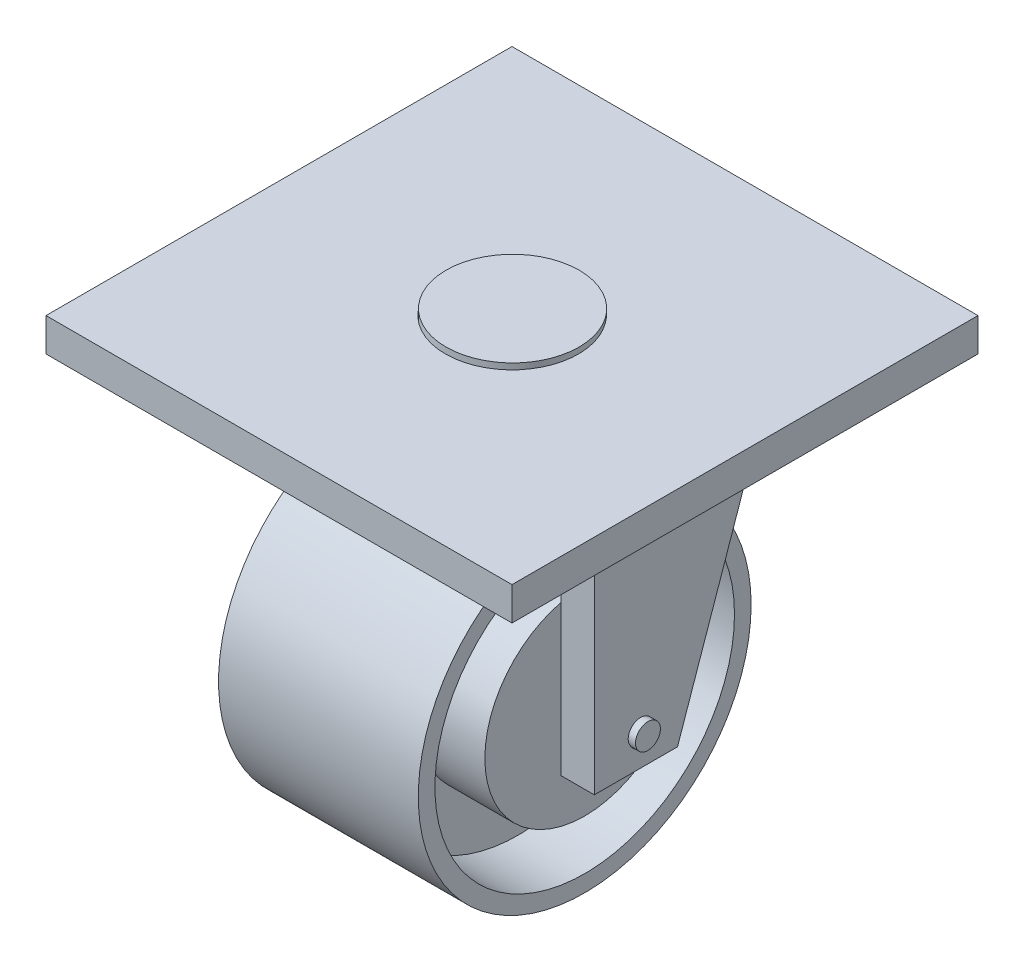
ISO-10303-21;
HEADER;
FILE_DESCRIPTION(('STEP AP214'),'2;1');
FILE_NAME('part.step','',(''),(''),'','','');
FILE_SCHEMA(('AUTOMOTIVE_DESIGN { 1 0 10303 214 1 1 1 1 }'));
ENDSEC;
DATA;
#1=APPLICATION_CONTEXT('core data for automotive mechanical design processes');
#2=APPLICATION_PROTOCOL_DEFINITION('international standard','automotive_design',2000,#1);
#3=PRODUCT_CONTEXT('',#1,'mechanical');
#4=PRODUCT('Part','Part','',(#3));
#5=PRODUCT_RELATED_PRODUCT_CATEGORY('part','',(#4));
#6=PRODUCT_DEFINITION_FORMATION('','',#4);
#7=PRODUCT_DEFINITION_CONTEXT('part definition',#1,'design');
#8=PRODUCT_DEFINITION('design','',#6,#7);
#9=PRODUCT_DEFINITION_SHAPE('','',#8);
#10=(LENGTH_UNIT() NAMED_UNIT(*) SI_UNIT(.MILLI.,.METRE.));
#11=(NAMED_UNIT(*) PLANE_ANGLE_UNIT() SI_UNIT($,.RADIAN.));
#12=(NAMED_UNIT(*) SI_UNIT($,.STERADIAN.) SOLID_ANGLE_UNIT());
#13=UNCERTAINTY_MEASURE_WITH_UNIT(LENGTH_MEASURE(1.E-05),#10,'distance_accuracy_value','');
#14=(GEOMETRIC_REPRESENTATION_CONTEXT(3) GLOBAL_UNCERTAINTY_ASSIGNED_CONTEXT((#13)) GLOBAL_UNIT_ASSIGNED_CONTEXT((#10,
#11,#12)) REPRESENTATION_CONTEXT('',''));
#15=CARTESIAN_POINT('',(0.,0.,0.));
#16=DIRECTION('',(0.,0.,1.));
#17=DIRECTION('',(1.,0.,0.));
#18=AXIS2_PLACEMENT_3D('',#15,#16,#17);
#19=CARTESIAN_POINT('',(-7.63342853739944,6.14559672903132,19.4440529927582));
#20=DIRECTION('',(1.,0.,0.));
#21=DIRECTION('',(0.,0.,-1.));
#22=AXIS2_PLACEMENT_3D('',#19,#20,#21);
#23=PLANE('',#22);
#24=DIRECTION('',(0.,-0.949497336702955,0.313775090779996));
#25=VECTOR('',#24,1.);
#26=CARTESIAN_POINT('',(-7.63342853739944,12.8166493606103,16.9669845814205));
#27=LINE('',#26,#25);
#28=CARTESIAN_POINT('',(-7.63342853739944,11.0807509480564,17.540637251027));
#29=VERTEX_POINT('',#28);
#30=CARTESIAN_POINT('',(-7.63342853739944,10.9260844776881,17.591749017121));
#31=VERTEX_POINT('',#30);
#32=EDGE_CURVE('P0_E25',#29,#31,#27,.T.);
#33=ORIENTED_EDGE('',*,*,#32,.F.);
#34=DIRECTION('',(0.,-1.,0.));
#35=VECTOR('',#34,1.);
#36=CARTESIAN_POINT('',(-7.63342853739944,10.9260844776881,17.540637251027));
#37=LINE('',#36,#35);
#38=CARTESIAN_POINT('',(-7.63342853739944,10.9260844776881,17.540637251027));
#39=VERTEX_POINT('',#38);
#40=EDGE_CURVE('P0_E148',#29,#39,#37,.T.);
#41=ORIENTED_EDGE('',*,*,#40,.T.);
#42=DIRECTION('',(0.,0.,1.));
#43=VECTOR('',#42,1.);
#44=CARTESIAN_POINT('',(-7.63342853739944,10.9260844776881,17.540637251027));
#45=LINE('',#44,#43);
#46=EDGE_CURVE('P0_E154',#39,#31,#45,.T.);
#47=ORIENTED_EDGE('',*,*,#46,.T.);
#48=EDGE_LOOP('',(#33,#41,#47));
#49=FACE_BOUND('',#48,.T.);
#50=ADVANCED_FACE('P0_F17',(#49),#23,.F.);
#51=CARTESIAN_POINT('',(7.36657146260056,6.14559672903132,19.4440529927582));
#52=DIRECTION('',(1.,0.,0.));
#53=DIRECTION('',(0.,0.,-1.));
#54=AXIS2_PLACEMENT_3D('',#51,#52,#53);
#55=PLANE('',#54);
#56=CARTESIAN_POINT('',(7.36657146260056,-0.380758504231076,24.0683800608071));
#57=DIRECTION('',(-1.,0.,0.));
#58=DIRECTION('',(0.,0.,1.));
#59=AXIS2_PLACEMENT_3D('',#56,#57,#58);
#60=CIRCLE('',#59,0.75);
#61=CARTESIAN_POINT('',(7.36657146260056,-0.380758504231076,24.8183800608071));
#62=VERTEX_POINT('',#61);
#63=EDGE_CURVE('P0_E171',#62,#62,#60,.T.);
#64=ORIENTED_EDGE('',*,*,#63,.F.);
#65=EDGE_LOOP('',(#64));
#66=FACE_BOUND('',#65,.T.);
#67=DIRECTION('',(0.,1.,0.));
#68=VECTOR('',#67,1.);
#69=CARTESIAN_POINT('',(7.36657146260056,10.9260844776881,26.3072646418272));
#70=LINE('',#69,#68);
#71=CARTESIAN_POINT('',(7.36657146260056,10.9260844776881,26.3072646418272));
#72=VERTEX_POINT('',#71);
#73=CARTESIAN_POINT('',(7.36657146260056,12.8166493606103,26.3072646418272));
#74=VERTEX_POINT('',#73);
#75=EDGE_CURVE('P0_E39',#72,#74,#70,.T.);
#76=ORIENTED_EDGE('',*,*,#75,.F.);
#77=DIRECTION('',(0.,0.,1.));
#78=VECTOR('',#77,1.);
#79=CARTESIAN_POINT('',(7.36657146260056,10.9260844776881,17.540637251027));
#80=LINE('',#79,#78);
#81=CARTESIAN_POINT('',(7.36657146260056,10.9260844776881,17.540637251027));
#82=VERTEX_POINT('',#81);
#83=EDGE_CURVE('P0_E149',#82,#72,#80,.T.);
#84=ORIENTED_EDGE('',*,*,#83,.F.);
#85=DIRECTION('',(0.,-1.,0.));
#86=VECTOR('',#85,1.);
#87=CARTESIAN_POINT('',(7.36657146260056,10.9260844776881,17.540637251027));
#88=LINE('',#87,#86);
#89=CARTESIAN_POINT('',(7.36657146260056,12.8166493606103,17.540637251027));
#90=VERTEX_POINT('',#89);
#91=EDGE_CURVE('P0_E139',#90,#82,#88,.T.);
#92=ORIENTED_EDGE('',*,*,#91,.F.);
#93=DIRECTION('',(0.,0.,1.));
#94=VECTOR('',#93,1.);
#95=CARTESIAN_POINT('',(7.36657146260056,12.8166493606103,21.9045793085477));
#96=LINE('',#95,#94);
#97=CARTESIAN_POINT('',(7.36657146260056,12.8166493606103,16.7203687822319));
#98=VERTEX_POINT('',#97);
#99=EDGE_CURVE('P0_E182',#98,#90,#96,.T.);
#100=ORIENTED_EDGE('',*,*,#99,.F.);
#101=DIRECTION('',(0.,0.945143673740315,-0.326654918819022));
#102=VECTOR('',#101,1.);
#103=CARTESIAN_POINT('',(7.36657146260056,12.8166493606103,16.7203687822319));
#104=LINE('',#103,#102);
#105=CARTESIAN_POINT('',(7.36657146260056,-2.18335063938973,21.9045793085477));
#106=VERTEX_POINT('',#105);
#107=EDGE_CURVE('P0_E193',#106,#98,#104,.T.);
#108=ORIENTED_EDGE('',*,*,#107,.F.);
#109=DIRECTION('',(0.,0.,-1.));
#110=VECTOR('',#109,1.);
#111=CARTESIAN_POINT('',(7.36657146260056,-2.18335063938973,21.9045793085477));
#112=LINE('',#111,#110);
#113=CARTESIAN_POINT('',(7.36657146260056,-2.18335063938973,26.9045793085477));
#114=VERTEX_POINT('',#113);
#115=EDGE_CURVE('P0_E191',#114,#106,#112,.T.);
#116=ORIENTED_EDGE('',*,*,#115,.F.);
#117=DIRECTION('',(0.,-1.,0.));
#118=VECTOR('',#117,1.);
#119=CARTESIAN_POINT('',(7.36657146260056,12.8166493606103,26.9045793085477));
#120=LINE('',#119,#118);
#121=CARTESIAN_POINT('',(7.36657146260056,12.8166493606103,26.9045793085477));
#122=VERTEX_POINT('',#121);
#123=EDGE_CURVE('P0_E175',#122,#114,#120,.T.);
#124=ORIENTED_EDGE('',*,*,#123,.F.);
#125=EDGE_CURVE('P0_E195',#74,#122,#96,.T.);
#126=ORIENTED_EDGE('',*,*,#125,.F.);
#127=EDGE_LOOP('',(#76,#84,#92,#100,#108,#116,#124,#126));
#128=FACE_BOUND('',#127,.T.);
#129=ADVANCED_FACE('P0_F253',(#66,#128),#55,.F.);
#130=CARTESIAN_POINT('',(9.36657146260056,12.8166493606103,26.9045793085477));
#131=DIRECTION('',(0.,0.,-1.));
#132=DIRECTION('',(-1.,0.,0.));
#133=AXIS2_PLACEMENT_3D('',#130,#131,#132);
#134=PLANE('',#133);
#135=ORIENTED_EDGE('',*,*,#123,.T.);
#136=DIRECTION('',(-1.,0.,0.));
#137=VECTOR('',#136,1.);
#138=CARTESIAN_POINT('',(9.36657146260056,-2.18335063938973,26.9045793085477));
#139=LINE('',#138,#137);
#140=CARTESIAN_POINT('',(9.36657146260056,-2.18335063938973,26.9045793085477));
#141=VERTEX_POINT('',#140);
#142=EDGE_CURVE('P0_E202',#141,#114,#139,.T.);
#143=ORIENTED_EDGE('',*,*,#142,.F.);
#144=DIRECTION('',(0.,-1.,0.));
#145=VECTOR('',#144,1.);
#146=CARTESIAN_POINT('',(9.36657146260056,12.8166493606103,26.9045793085477));
#147=LINE('',#146,#145);
#148=CARTESIAN_POINT('',(9.36657146260056,12.8166493606103,26.9045793085477));
#149=VERTEX_POINT('',#148);
#150=EDGE_CURVE('P0_E181',#149,#141,#147,.T.);
#151=ORIENTED_EDGE('',*,*,#150,.F.);
#152=DIRECTION('',(-1.,0.,0.));
#153=VECTOR('',#152,1.);
#154=CARTESIAN_POINT('',(9.36657146260056,12.8166493606103,26.9045793085477));
#155=LINE('',#154,#153);
#156=EDGE_CURVE('P0_E204',#149,#122,#155,.T.);
#157=ORIENTED_EDGE('',*,*,#156,.T.);
#158=EDGE_LOOP('',(#135,#143,#151,#157));
#159=FACE_BOUND('',#158,.T.);
#160=ADVANCED_FACE('P0_F19',(#159),#134,.F.);
#161=CARTESIAN_POINT('',(9.36657146260056,-2.18335063938973,21.9045793085477));
#162=DIRECTION('',(0.,1.,0.));
#163=DIRECTION('',(0.,0.,1.));
#164=AXIS2_PLACEMENT_3D('',#161,#162,#163);
#165=PLANE('',#164);
#166=ORIENTED_EDGE('',*,*,#115,.T.);
#167=DIRECTION('',(-1.,0.,0.));
#168=VECTOR('',#167,1.);
#169=CARTESIAN_POINT('',(9.36657146260056,-2.18335063938973,21.9045793085477));
#170=LINE('',#169,#168);
#171=CARTESIAN_POINT('',(9.36657146260056,-2.18335063938973,21.9045793085477));
#172=VERTEX_POINT('',#171);
#173=EDGE_CURVE('P0_E199',#172,#106,#170,.T.);
#174=ORIENTED_EDGE('',*,*,#173,.F.);
#175=DIRECTION('',(0.,0.,-1.));
#176=VECTOR('',#175,1.);
#177=CARTESIAN_POINT('',(9.36657146260056,-2.18335063938973,21.9045793085477));
#178=LINE('',#177,#176);
#179=EDGE_CURVE('P0_E184',#141,#172,#178,.T.);
#180=ORIENTED_EDGE('',*,*,#179,.F.);
#181=ORIENTED_EDGE('',*,*,#142,.T.);
#182=EDGE_LOOP('',(#166,#174,#180,#181));
#183=FACE_BOUND('',#182,.T.);
#184=ADVANCED_FACE('P0_F267',(#183),#165,.F.);
#185=CARTESIAN_POINT('',(9.36657146260056,12.8166493606103,16.7203687822319));
#186=DIRECTION('',(0.,0.326654918819022,0.945143673740315));
#187=DIRECTION('',(0.,-0.945143673740315,0.326654918819022));
#188=AXIS2_PLACEMENT_3D('',#185,#186,#187);
#189=PLANE('',#188);
#190=ORIENTED_EDGE('',*,*,#107,.T.);
#191=DIRECTION('',(-1.,0.,0.));
#192=VECTOR('',#191,1.);
#193=CARTESIAN_POINT('',(9.36657146260056,12.8166493606103,16.7203687822319));
#194=LINE('',#193,#192);
#195=CARTESIAN_POINT('',(9.36657146260056,12.8166493606103,16.7203687822319));
#196=VERTEX_POINT('',#195);
#197=EDGE_CURVE('P0_E189',#196,#98,#194,.T.);
#198=ORIENTED_EDGE('',*,*,#197,.F.);
#199=DIRECTION('',(0.,0.945143673740315,-0.326654918819022));
#200=VECTOR('',#199,1.);
#201=CARTESIAN_POINT('',(9.36657146260056,12.8166493606103,16.7203687822319));
#202=LINE('',#201,#200);
#203=EDGE_CURVE('P0_E186',#172,#196,#202,.T.);
#204=ORIENTED_EDGE('',*,*,#203,.F.);
#205=ORIENTED_EDGE('',*,*,#173,.T.);
#206=EDGE_LOOP('',(#190,#198,#204,#205));
#207=FACE_BOUND('',#206,.T.);
#208=ADVANCED_FACE('P0_F262',(#207),#189,.F.);
#209=CARTESIAN_POINT('',(9.36657146260056,12.8166493606103,21.9045793085477));
#210=DIRECTION('',(0.,-1.,0.));
#211=DIRECTION('',(0.,0.,-1.));
#212=AXIS2_PLACEMENT_3D('',#209,#210,#211);
#213=PLANE('',#212);
#214=CARTESIAN_POINT('',(-0.391053106238549,12.8166493606103,22.0572646418272));
#215=DIRECTION('',(0.,-1.,0.));
#216=DIRECTION('',(0.,0.,-1.));
#217=AXIS2_PLACEMENT_3D('',#214,#215,#216);
#218=CIRCLE('',#217,4.);
#219=CARTESIAN_POINT('',(-0.391053106238549,12.8166493606103,18.0572646418272));
#220=VERTEX_POINT('',#219);
#221=EDGE_CURVE('P0_E11',#220,#220,#218,.F.);
#222=ORIENTED_EDGE('',*,*,#221,.F.);
#223=EDGE_LOOP('',(#222));
#224=FACE_BOUND('',#223,.T.);
#225=ORIENTED_EDGE('',*,*,#99,.T.);
#226=DIRECTION('',(1.,0.,0.));
#227=VECTOR('',#226,1.);
#228=CARTESIAN_POINT('',(-7.63342853739944,12.8166493606103,17.540637251027));
#229=LINE('',#228,#227);
#230=CARTESIAN_POINT('',(-7.63342853739944,12.8166493606103,17.540637251027));
#231=VERTEX_POINT('',#230);
#232=EDGE_CURVE('P0_E165',#231,#90,#229,.T.);
#233=ORIENTED_EDGE('',*,*,#232,.F.);
#234=DIRECTION('',(0.,0.,-1.));
#235=VECTOR('',#234,1.);
#236=CARTESIAN_POINT('',(-7.63342853739944,12.8166493606103,21.9239509464271));
#237=LINE('',#236,#235);
#238=CARTESIAN_POINT('',(-7.63342853739944,12.8166493606103,16.9669845814205));
#239=VERTEX_POINT('',#238);
#240=EDGE_CURVE('P0_E136',#231,#239,#237,.T.);
#241=ORIENTED_EDGE('',*,*,#240,.T.);
#242=DIRECTION('',(1.,0.,0.));
#243=VECTOR('',#242,1.);
#244=CARTESIAN_POINT('',(-9.63342853739944,12.8166493606103,16.9669845814205));
#245=LINE('',#244,#243);
#246=CARTESIAN_POINT('',(-9.63342853739944,12.8166493606103,16.9669845814205));
#247=VERTEX_POINT('',#246);
#248=EDGE_CURVE('P0_E116',#247,#239,#245,.T.);
#249=ORIENTED_EDGE('',*,*,#248,.F.);
#250=DIRECTION('',(0.,0.,-1.));
#251=VECTOR('',#250,1.);
#252=CARTESIAN_POINT('',(-9.63342853739944,12.8166493606103,21.9239509464271));
#253=LINE('',#252,#251);
#254=CARTESIAN_POINT('',(-9.63342853739944,12.8166493606103,26.421813011273));
#255=VERTEX_POINT('',#254);
#256=EDGE_CURVE('P0_E122',#255,#247,#253,.T.);
#257=ORIENTED_EDGE('',*,*,#256,.F.);
#258=DIRECTION('',(1.,0.,0.));
#259=VECTOR('',#258,1.);
#260=CARTESIAN_POINT('',(-9.63342853739944,12.8166493606103,26.421813011273));
#261=LINE('',#260,#259);
#262=CARTESIAN_POINT('',(-7.63342853739944,12.8166493606103,26.421813011273));
#263=VERTEX_POINT('',#262);
#264=EDGE_CURVE('P0_E226',#255,#263,#261,.T.);
#265=ORIENTED_EDGE('',*,*,#264,.T.);
#266=CARTESIAN_POINT('',(-7.63342853739944,12.8166493606103,26.3072646418272));
#267=VERTEX_POINT('',#266);
#268=EDGE_CURVE('P0_E131',#263,#267,#237,.T.);
#269=ORIENTED_EDGE('',*,*,#268,.T.);
#270=DIRECTION('',(1.,0.,0.));
#271=VECTOR('',#270,1.);
#272=CARTESIAN_POINT('',(-7.63342853739944,12.8166493606103,26.3072646418272));
#273=LINE('',#272,#271);
#274=EDGE_CURVE('P0_E168',#267,#74,#273,.T.);
#275=ORIENTED_EDGE('',*,*,#274,.T.);
#276=ORIENTED_EDGE('',*,*,#125,.T.);
#277=ORIENTED_EDGE('',*,*,#156,.F.);
#278=DIRECTION('',(0.,0.,1.));
#279=VECTOR('',#278,1.);
#280=CARTESIAN_POINT('',(9.36657146260056,12.8166493606103,21.9045793085477));
#281=LINE('',#280,#279);
#282=EDGE_CURVE('P0_E178',#196,#149,#281,.T.);
#283=ORIENTED_EDGE('',*,*,#282,.F.);
#284=ORIENTED_EDGE('',*,*,#197,.T.);
#285=EDGE_LOOP('',(#225,#233,#241,#249,#257,#265,#269,#275,#276,#277,#283,#284));
#286=FACE_BOUND('',#285,.T.);
#287=ADVANCED_FACE('P0_F134',(#224,#286),#213,.F.);
#288=CARTESIAN_POINT('',(9.36657146260056,6.14559672903132,19.4440529927582));
#289=DIRECTION('',(1.,0.,0.));
#290=DIRECTION('',(0.,0.,-1.));
#291=AXIS2_PLACEMENT_3D('',#288,#289,#290);
#292=PLANE('',#291);
#293=CARTESIAN_POINT('',(9.36657146260056,-0.380758504231076,24.0683800608071));
#294=DIRECTION('',(-1.,0.,0.));
#295=DIRECTION('',(0.,0.,1.));
#296=AXIS2_PLACEMENT_3D('',#293,#294,#295);
#297=CIRCLE('',#296,0.75);
#298=CARTESIAN_POINT('',(9.36657146260056,-0.380758504231076,24.8183800608071));
#299=VERTEX_POINT('',#298);
#300=EDGE_CURVE('P0_E172',#299,#299,#297,.T.);
#301=ORIENTED_EDGE('',*,*,#300,.T.);
#302=EDGE_LOOP('',(#301));
#303=FACE_BOUND('',#302,.T.);
#304=ORIENTED_EDGE('',*,*,#282,.T.);
#305=ORIENTED_EDGE('',*,*,#150,.T.);
#306=ORIENTED_EDGE('',*,*,#179,.T.);
#307=ORIENTED_EDGE('',*,*,#203,.T.);
#308=EDGE_LOOP('',(#304,#305,#306,#307));
#309=FACE_BOUND('',#308,.T.);
#310=ADVANCED_FACE('P0_F270',(#303,#309),#292,.T.);
#311=CARTESIAN_POINT('',(9.36657146260056,-0.380758504231076,24.0683800608071));
#312=DIRECTION('',(-1.,0.,0.));
#313=DIRECTION('',(0.,0.,1.));
#314=AXIS2_PLACEMENT_3D('',#311,#312,#313);
#315=CYLINDRICAL_SURFACE('',#314,0.75);
#316=ORIENTED_EDGE('',*,*,#300,.F.);
#317=EDGE_LOOP('',(#316));
#318=FACE_BOUND('',#317,.T.);
#319=ORIENTED_EDGE('',*,*,#63,.T.);
#320=EDGE_LOOP('',(#319));
#321=FACE_BOUND('',#320,.T.);
#322=ADVANCED_FACE('P0_F272',(#318,#321),#315,.F.);
#323=CARTESIAN_POINT('',(-7.63342853739944,10.9260844776881,26.3072646418272));
#324=DIRECTION('',(0.,0.,-1.));
#325=DIRECTION('',(-1.,0.,0.));
#326=AXIS2_PLACEMENT_3D('',#323,#324,#325);
#327=PLANE('',#326);
#328=ORIENTED_EDGE('',*,*,#75,.T.);
#329=ORIENTED_EDGE('',*,*,#274,.F.);
#330=DIRECTION('',(0.,1.,0.));
#331=VECTOR('',#330,1.);
#332=CARTESIAN_POINT('',(-7.63342853739944,10.9260844776881,26.3072646418272));
#333=LINE('',#332,#331);
#334=CARTESIAN_POINT('',(-7.63342853739944,10.9260844776881,26.3072646418272));
#335=VERTEX_POINT('',#334);
#336=EDGE_CURVE('P0_E145',#335,#267,#333,.T.);
#337=ORIENTED_EDGE('',*,*,#336,.F.);
#338=DIRECTION('',(1.,0.,0.));
#339=VECTOR('',#338,1.);
#340=CARTESIAN_POINT('',(-7.63342853739944,10.9260844776881,26.3072646418272));
#341=LINE('',#340,#339);
#342=EDGE_CURVE('P0_E155',#335,#72,#341,.T.);
#343=ORIENTED_EDGE('',*,*,#342,.T.);
#344=EDGE_LOOP('',(#328,#329,#337,#343));
#345=FACE_BOUND('',#344,.T.);
#346=ADVANCED_FACE('P0_F247',(#345),#327,.F.);
#347=CARTESIAN_POINT('',(-7.63342853739944,10.9260844776881,17.540637251027));
#348=DIRECTION('',(0.,0.,1.));
#349=DIRECTION('',(1.,0.,0.));
#350=AXIS2_PLACEMENT_3D('',#347,#348,#349);
#351=PLANE('',#350);
#352=ORIENTED_EDGE('',*,*,#91,.T.);
#353=DIRECTION('',(1.,0.,0.));
#354=VECTOR('',#353,1.);
#355=CARTESIAN_POINT('',(-7.63342853739944,10.9260844776881,17.540637251027));
#356=LINE('',#355,#354);
#357=EDGE_CURVE('P0_E162',#39,#82,#356,.T.);
#358=ORIENTED_EDGE('',*,*,#357,.F.);
#359=ORIENTED_EDGE('',*,*,#40,.F.);
#360=EDGE_CURVE('P0_E150',#231,#29,#37,.T.);
#361=ORIENTED_EDGE('',*,*,#360,.F.);
#362=ORIENTED_EDGE('',*,*,#232,.T.);
#363=EDGE_LOOP('',(#352,#358,#359,#361,#362));
#364=FACE_BOUND('',#363,.T.);
#365=ADVANCED_FACE('P0_F256',(#364),#351,.F.);
#366=CARTESIAN_POINT('',(-7.63342853739944,10.9260844776881,17.540637251027));
#367=DIRECTION('',(0.,1.,0.));
#368=DIRECTION('',(0.,0.,1.));
#369=AXIS2_PLACEMENT_3D('',#366,#367,#368);
#370=PLANE('',#369);
#371=ORIENTED_EDGE('',*,*,#83,.T.);
#372=ORIENTED_EDGE('',*,*,#342,.F.);
#373=EDGE_CURVE('P0_E153',#31,#335,#45,.T.);
#374=ORIENTED_EDGE('',*,*,#373,.F.);
#375=ORIENTED_EDGE('',*,*,#46,.F.);
#376=ORIENTED_EDGE('',*,*,#357,.T.);
#377=EDGE_LOOP('',(#371,#372,#374,#375,#376));
#378=FACE_BOUND('',#377,.T.);
#379=ADVANCED_FACE('P0_F250',(#378),#370,.F.);
#380=CARTESIAN_POINT('',(-7.63342853739944,6.14559672903132,19.4440529927582));
#381=DIRECTION('',(-1.,0.,0.));
#382=DIRECTION('',(0.,0.,1.));
#383=AXIS2_PLACEMENT_3D('',#380,#381,#382);
#384=PLANE('',#383);
#385=ORIENTED_EDGE('',*,*,#240,.F.);
#386=ORIENTED_EDGE('',*,*,#360,.T.);
#387=EDGE_CURVE('P0_E209',#239,#29,#27,.T.);
#388=ORIENTED_EDGE('',*,*,#387,.F.);
#389=EDGE_LOOP('',(#385,#386,#388));
#390=FACE_BOUND('',#389,.T.);
#391=ADVANCED_FACE('P0_F296',(#390),#384,.F.);
#392=CARTESIAN_POINT('',(-7.63342853739944,-0.380758504231076,24.0683800608071));
#393=DIRECTION('',(-1.,0.,0.));
#394=DIRECTION('',(0.,0.,1.));
#395=AXIS2_PLACEMENT_3D('',#392,#393,#394);
#396=CIRCLE('',#395,0.75);
#397=CARTESIAN_POINT('',(-7.63342853739944,-0.380758504231076,24.8183800608071));
#398=VERTEX_POINT('',#397);
#399=EDGE_CURVE('P0_E214',#398,#398,#396,.T.);
#400=ORIENTED_EDGE('',*,*,#399,.T.);
#401=EDGE_LOOP('',(#400));
#402=FACE_BOUND('',#401,.T.);
#403=ORIENTED_EDGE('',*,*,#373,.T.);
#404=ORIENTED_EDGE('',*,*,#336,.T.);
#405=ORIENTED_EDGE('',*,*,#268,.F.);
#406=DIRECTION('',(0.,1.,0.));
#407=VECTOR('',#406,1.);
#408=CARTESIAN_POINT('',(-7.63342853739944,12.8166493606103,26.421813011273));
#409=LINE('',#408,#407);
#410=CARTESIAN_POINT('',(-7.63342853739944,-2.18335063938973,26.421813011273));
#411=VERTEX_POINT('',#410);
#412=EDGE_CURVE('P0_E233',#411,#263,#409,.T.);
#413=ORIENTED_EDGE('',*,*,#412,.F.);
#414=DIRECTION('',(0.,0.,1.));
#415=VECTOR('',#414,1.);
#416=CARTESIAN_POINT('',(-7.63342853739944,-2.18335063938973,21.9239509464271));
#417=LINE('',#416,#415);
#418=CARTESIAN_POINT('',(-7.63342853739944,-2.18335063938973,21.9239509464271));
#419=VERTEX_POINT('',#418);
#420=EDGE_CURVE('P0_E213',#419,#411,#417,.T.);
#421=ORIENTED_EDGE('',*,*,#420,.F.);
#422=EDGE_CURVE('P0_E210',#31,#419,#27,.T.);
#423=ORIENTED_EDGE('',*,*,#422,.F.);
#424=EDGE_LOOP('',(#403,#404,#405,#413,#421,#423));
#425=FACE_BOUND('',#424,.T.);
#426=ADVANCED_FACE('P0_F243',(#402,#425),#384,.F.);
#427=CARTESIAN_POINT('',(-9.63342853739944,12.8166493606103,16.9669845814205));
#428=DIRECTION('',(0.,0.313775090779996,0.949497336702955));
#429=DIRECTION('',(0.,-0.949497336702955,0.313775090779996));
#430=AXIS2_PLACEMENT_3D('',#427,#428,#429);
#431=PLANE('',#430);
#432=ORIENTED_EDGE('',*,*,#387,.T.);
#433=ORIENTED_EDGE('',*,*,#32,.T.);
#434=ORIENTED_EDGE('',*,*,#422,.T.);
#435=DIRECTION('',(1.,0.,0.));
#436=VECTOR('',#435,1.);
#437=CARTESIAN_POINT('',(-9.63342853739944,-2.18335063938973,21.9239509464271));
#438=LINE('',#437,#436);
#439=CARTESIAN_POINT('',(-9.63342853739944,-2.18335063938973,21.9239509464271));
#440=VERTEX_POINT('',#439);
#441=EDGE_CURVE('P0_E118',#440,#419,#438,.T.);
#442=ORIENTED_EDGE('',*,*,#441,.F.);
#443=DIRECTION('',(0.,-0.949497336702955,0.313775090779996));
#444=VECTOR('',#443,1.);
#445=CARTESIAN_POINT('',(-9.63342853739944,12.8166493606103,16.9669845814205));
#446=LINE('',#445,#444);
#447=EDGE_CURVE('P0_E111',#247,#440,#446,.T.);
#448=ORIENTED_EDGE('',*,*,#447,.F.);
#449=ORIENTED_EDGE('',*,*,#248,.T.);
#450=EDGE_LOOP('',(#432,#433,#434,#442,#448,#449));
#451=FACE_BOUND('',#450,.T.);
#452=ADVANCED_FACE('P0_F114',(#451),#431,.F.);
#453=CARTESIAN_POINT('',(-9.63342853739944,-2.18335063938973,21.9239509464271));
#454=DIRECTION('',(0.,1.,0.));
#455=DIRECTION('',(0.,0.,1.));
#456=AXIS2_PLACEMENT_3D('',#453,#454,#455);
#457=PLANE('',#456);
#458=ORIENTED_EDGE('',*,*,#420,.T.);
#459=DIRECTION('',(1.,0.,0.));
#460=VECTOR('',#459,1.);
#461=CARTESIAN_POINT('',(-9.63342853739944,-2.18335063938973,26.421813011273));
#462=LINE('',#461,#460);
#463=CARTESIAN_POINT('',(-9.63342853739944,-2.18335063938973,26.421813011273));
#464=VERTEX_POINT('',#463);
#465=EDGE_CURVE('P0_E141',#464,#411,#462,.T.);
#466=ORIENTED_EDGE('',*,*,#465,.F.);
#467=DIRECTION('',(0.,0.,1.));
#468=VECTOR('',#467,1.);
#469=CARTESIAN_POINT('',(-9.63342853739944,-2.18335063938973,21.9239509464271));
#470=LINE('',#469,#468);
#471=EDGE_CURVE('P0_E121',#440,#464,#470,.T.);
#472=ORIENTED_EDGE('',*,*,#471,.F.);
#473=ORIENTED_EDGE('',*,*,#441,.T.);
#474=EDGE_LOOP('',(#458,#466,#472,#473));
#475=FACE_BOUND('',#474,.T.);
#476=ADVANCED_FACE('P0_F237',(#475),#457,.F.);
#477=CARTESIAN_POINT('',(-9.63342853739944,12.8166493606103,26.421813011273));
#478=DIRECTION('',(0.,0.,-1.));
#479=DIRECTION('',(0.,1.,0.));
#480=AXIS2_PLACEMENT_3D('',#477,#478,#479);
#481=PLANE('',#480);
#482=ORIENTED_EDGE('',*,*,#412,.T.);
#483=ORIENTED_EDGE('',*,*,#264,.F.);
#484=DIRECTION('',(0.,1.,0.));
#485=VECTOR('',#484,1.);
#486=CARTESIAN_POINT('',(-9.63342853739944,12.8166493606103,26.421813011273));
#487=LINE('',#486,#485);
#488=EDGE_CURVE('P0_E127',#464,#255,#487,.T.);
#489=ORIENTED_EDGE('',*,*,#488,.F.);
#490=ORIENTED_EDGE('',*,*,#465,.T.);
#491=EDGE_LOOP('',(#482,#483,#489,#490));
#492=FACE_BOUND('',#491,.T.);
#493=ADVANCED_FACE('P0_F241',(#492),#481,.F.);
#494=CARTESIAN_POINT('',(-9.63342853739944,6.14559672903132,19.4440529927582));
#495=DIRECTION('',(-1.,0.,0.));
#496=DIRECTION('',(0.,0.,1.));
#497=AXIS2_PLACEMENT_3D('',#494,#495,#496);
#498=PLANE('',#497);
#499=CARTESIAN_POINT('',(-9.63342853739944,-0.380758504231076,24.0683800608071));
#500=DIRECTION('',(-1.,0.,0.));
#501=DIRECTION('',(0.,0.,1.));
#502=AXIS2_PLACEMENT_3D('',#499,#500,#501);
#503=CIRCLE('',#502,0.75);
#504=CARTESIAN_POINT('',(-9.63342853739944,-0.380758504231076,24.8183800608071));
#505=VERTEX_POINT('',#504);
#506=EDGE_CURVE('P0_E217',#505,#505,#503,.T.);
#507=ORIENTED_EDGE('',*,*,#506,.F.);
#508=EDGE_LOOP('',(#507));
#509=FACE_BOUND('',#508,.T.);
#510=ORIENTED_EDGE('',*,*,#256,.T.);
#511=ORIENTED_EDGE('',*,*,#447,.T.);
#512=ORIENTED_EDGE('',*,*,#471,.T.);
#513=ORIENTED_EDGE('',*,*,#488,.T.);
#514=EDGE_LOOP('',(#510,#511,#512,#513));
#515=FACE_BOUND('',#514,.T.);
#516=ADVANCED_FACE('P0_F125',(#509,#515),#498,.T.);
#517=CARTESIAN_POINT('',(-7.63342853739944,-0.380758504231076,24.0683800608071));
#518=DIRECTION('',(-1.,0.,0.));
#519=DIRECTION('',(0.,0.,1.));
#520=AXIS2_PLACEMENT_3D('',#517,#518,#519);
#521=CYLINDRICAL_SURFACE('',#520,0.75);
#522=ORIENTED_EDGE('',*,*,#399,.F.);
#523=EDGE_LOOP('',(#522));
#524=FACE_BOUND('',#523,.T.);
#525=ORIENTED_EDGE('',*,*,#506,.T.);
#526=EDGE_LOOP('',(#525));
#527=FACE_BOUND('',#526,.T.);
#528=ADVANCED_FACE('P0_F348',(#524,#527),#521,.F.);
#529=CARTESIAN_POINT('',(-0.391053106238549,15.8166493606103,22.0572646418272));
#530=DIRECTION('',(0.,-1.,0.));
#531=DIRECTION('',(0.,0.,-1.));
#532=AXIS2_PLACEMENT_3D('',#529,#530,#531);
#533=CYLINDRICAL_SURFACE('',#532,4.);
#534=CARTESIAN_POINT('',(-0.391053106238549,15.8166493606103,22.0572646418272));
#535=DIRECTION('',(0.,1.,0.));
#536=DIRECTION('',(0.,0.,1.));
#537=AXIS2_PLACEMENT_3D('',#534,#535,#536);
#538=CIRCLE('',#537,4.);
#539=CARTESIAN_POINT('',(-0.391053106238549,15.8166493606103,26.0572646418272));
#540=VERTEX_POINT('',#539);
#541=EDGE_CURVE('P0_E222',#540,#540,#538,.T.);
#542=ORIENTED_EDGE('',*,*,#541,.F.);
#543=EDGE_LOOP('',(#542));
#544=FACE_BOUND('',#543,.T.);
#545=ORIENTED_EDGE('',*,*,#221,.T.);
#546=EDGE_LOOP('',(#545));
#547=FACE_BOUND('',#546,.T.);
#548=ADVANCED_FACE('P0_F356',(#544,#547),#533,.T.);
#549=CARTESIAN_POINT('',(-0.391053106238549,15.8166493606103,22.0572646418272));
#550=DIRECTION('',(0.,1.,0.));
#551=DIRECTION('',(0.,0.,1.));
#552=AXIS2_PLACEMENT_3D('',#549,#550,#551);
#553=PLANE('',#552);
#554=ORIENTED_EDGE('',*,*,#541,.T.);
#555=EDGE_LOOP('',(#554));
#556=FACE_BOUND('',#555,.T.);
#557=ADVANCED_FACE('P0_F364',(#556),#553,.T.);
#558=CLOSED_SHELL('',(#50,#129,#160,#184,#208,#287,#310,#322,#346,#365,#379,#391,#426,#452,#476,
#493,#516,#528,#548,#557));
#559=MANIFOLD_SOLID_BREP('P0_B1',#558);
#560=CARTESIAN_POINT('',(9.80232491394057,-0.297374108886705,24.1178988846155));
#561=DIRECTION('',(-1.,0.,0.));
#562=DIRECTION('',(0.,0.,1.));
#563=AXIS2_PLACEMENT_3D('',#560,#561,#562);
#564=CYLINDRICAL_SURFACE('',#563,0.75);
#565=CARTESIAN_POINT('',(9.80232491394057,-0.297374108886705,24.1178988846155));
#566=DIRECTION('',(1.,0.,0.));
#567=DIRECTION('',(0.,0.,-1.));
#568=AXIS2_PLACEMENT_3D('',#565,#566,#567);
#569=CIRCLE('',#568,0.75);
#570=CARTESIAN_POINT('',(9.80232491394057,-0.297374108886705,23.3678988846155));
#571=VERTEX_POINT('',#570);
#572=EDGE_CURVE('P1_E10',#571,#571,#569,.T.);
#573=ORIENTED_EDGE('',*,*,#572,.F.);
#574=EDGE_LOOP('',(#573));
#575=FACE_BOUND('',#574,.T.);
#576=CARTESIAN_POINT('',(-10.1976750860594,-0.297374108886705,24.1178988846155));
#577=DIRECTION('',(1.,0.,0.));
#578=DIRECTION('',(0.,0.,-1.));
#579=AXIS2_PLACEMENT_3D('',#576,#577,#578);
#580=CIRCLE('',#579,0.75);
#581=CARTESIAN_POINT('',(-10.1976750860594,-0.297374108886705,23.3678988846155));
#582=VERTEX_POINT('',#581);
#583=EDGE_CURVE('P1_E18',#582,#582,#580,.T.);
#584=ORIENTED_EDGE('',*,*,#583,.T.);
#585=EDGE_LOOP('',(#584));
#586=FACE_BOUND('',#585,.T.);
#587=ADVANCED_FACE('P1_F15',(#575,#586),#564,.T.);
#588=CARTESIAN_POINT('',(9.80232491394057,-0.297374108886705,24.1178988846155));
#589=DIRECTION('',(1.,0.,0.));
#590=DIRECTION('',(0.,0.,-1.));
#591=AXIS2_PLACEMENT_3D('',#588,#589,#590);
#592=PLANE('',#591);
#593=ORIENTED_EDGE('',*,*,#572,.T.);
#594=EDGE_LOOP('',(#593));
#595=FACE_BOUND('',#594,.T.);
#596=ADVANCED_FACE('P1_F30',(#595),#592,.T.);
#597=CARTESIAN_POINT('',(-10.1976750860594,-0.297374108886705,24.1178988846155));
#598=DIRECTION('',(1.,0.,0.));
#599=DIRECTION('',(0.,0.,-1.));
#600=AXIS2_PLACEMENT_3D('',#597,#598,#599);
#601=PLANE('',#600);
#602=ORIENTED_EDGE('',*,*,#583,.F.);
#603=EDGE_LOOP('',(#602));
#604=FACE_BOUND('',#603,.T.);
#605=ADVANCED_FACE('P1_F28',(#604),#601,.F.);
#606=CLOSED_SHELL('',(#587,#596,#605));
#607=MANIFOLD_SOLID_BREP('P1_B1',#606);
#608=CARTESIAN_POINT('',(5.88438748295379,-0.478966142048411,24.));
#609=DIRECTION('',(-1.,0.,0.));
#610=DIRECTION('',(0.,0.,1.));
#611=AXIS2_PLACEMENT_3D('',#608,#609,#610);
#612=CYLINDRICAL_SURFACE('',#611,10.);
#613=CARTESIAN_POINT('',(5.88438748295379,-0.478966142048411,24.));
#614=DIRECTION('',(1.,0.,0.));
#615=DIRECTION('',(0.,0.,-1.));
#616=AXIS2_PLACEMENT_3D('',#613,#614,#615);
#617=CIRCLE('',#616,10.);
#618=CARTESIAN_POINT('',(5.88438748295379,-0.478966142048411,14.));
#619=VERTEX_POINT('',#618);
#620=EDGE_CURVE('P2_E10',#619,#619,#617,.T.);
#621=ORIENTED_EDGE('',*,*,#620,.F.);
#622=EDGE_LOOP('',(#621));
#623=FACE_BOUND('',#622,.T.);
#624=CARTESIAN_POINT('',(-6.11561251704621,-0.478966142048411,24.));
#625=DIRECTION('',(1.,0.,0.));
#626=DIRECTION('',(0.,0.,-1.));
#627=AXIS2_PLACEMENT_3D('',#624,#625,#626);
#628=CIRCLE('',#627,10.);
#629=CARTESIAN_POINT('',(-6.11561251704621,-0.478966142048411,14.));
#630=VERTEX_POINT('',#629);
#631=EDGE_CURVE('P2_E22',#630,#630,#628,.T.);
#632=ORIENTED_EDGE('',*,*,#631,.T.);
#633=EDGE_LOOP('',(#632));
#634=FACE_BOUND('',#633,.T.);
#635=ADVANCED_FACE('P2_F15',(#623,#634),#612,.T.);
#636=CARTESIAN_POINT('',(5.88438748295379,-0.478966142048411,24.));
#637=DIRECTION('',(1.,0.,0.));
#638=DIRECTION('',(0.,0.,-1.));
#639=AXIS2_PLACEMENT_3D('',#636,#637,#638);
#640=PLANE('',#639);
#641=CARTESIAN_POINT('',(5.88438748295379,-0.478966142048411,24.));
#642=DIRECTION('',(1.,0.,0.));
#643=DIRECTION('',(0.,0.,-1.));
#644=AXIS2_PLACEMENT_3D('',#641,#642,#643);
#645=CIRCLE('',#644,9.);
#646=CARTESIAN_POINT('',(5.88438748295379,-0.478966142048411,15.));
#647=VERTEX_POINT('',#646);
#648=EDGE_CURVE('P2_E35',#647,#647,#645,.T.);
#649=ORIENTED_EDGE('',*,*,#648,.F.);
#650=EDGE_LOOP('',(#649));
#651=FACE_BOUND('',#650,.T.);
#652=ORIENTED_EDGE('',*,*,#620,.T.);
#653=EDGE_LOOP('',(#652));
#654=FACE_BOUND('',#653,.T.);
#655=ADVANCED_FACE('P2_F91',(#651,#654),#640,.T.);
#656=CARTESIAN_POINT('',(-6.11561251704621,-0.478966142048411,24.));
#657=DIRECTION('',(1.,0.,0.));
#658=DIRECTION('',(0.,0.,-1.));
#659=AXIS2_PLACEMENT_3D('',#656,#657,#658);
#660=PLANE('',#659);
#661=CARTESIAN_POINT('',(-6.11561251704621,-0.478966142048411,24.));
#662=DIRECTION('',(-1.,0.,0.));
#663=DIRECTION('',(0.,0.,1.));
#664=AXIS2_PLACEMENT_3D('',#661,#662,#663);
#665=CIRCLE('',#664,9.);
#666=CARTESIAN_POINT('',(-6.11561251704621,-0.478966142048411,33.));
#667=VERTEX_POINT('',#666);
#668=EDGE_CURVE('P2_E29',#667,#667,#665,.T.);
#669=ORIENTED_EDGE('',*,*,#668,.F.);
#670=EDGE_LOOP('',(#669));
#671=FACE_BOUND('',#670,.T.);
#672=ORIENTED_EDGE('',*,*,#631,.F.);
#673=EDGE_LOOP('',(#672));
#674=FACE_BOUND('',#673,.T.);
#675=ADVANCED_FACE('P2_F85',(#671,#674),#660,.F.);
#676=CARTESIAN_POINT('',(-2.11561251704621,-0.478966142048411,24.));
#677=DIRECTION('',(-1.,0.,0.));
#678=DIRECTION('',(0.,0.,1.));
#679=AXIS2_PLACEMENT_3D('',#676,#677,#678);
#680=CYLINDRICAL_SURFACE('',#679,9.);
#681=CARTESIAN_POINT('',(-2.11561251704621,-0.478966142048411,24.));
#682=DIRECTION('',(-1.,0.,0.));
#683=DIRECTION('',(0.,0.,1.));
#684=AXIS2_PLACEMENT_3D('',#681,#682,#683);
#685=CIRCLE('',#684,9.);
#686=CARTESIAN_POINT('',(-2.11561251704621,-0.478966142048411,33.));
#687=VERTEX_POINT('',#686);
#688=EDGE_CURVE('P2_E27',#687,#687,#685,.T.);
#689=ORIENTED_EDGE('',*,*,#688,.F.);
#690=EDGE_LOOP('',(#689));
#691=FACE_BOUND('',#690,.T.);
#692=ORIENTED_EDGE('',*,*,#668,.T.);
#693=EDGE_LOOP('',(#692));
#694=FACE_BOUND('',#693,.T.);
#695=ADVANCED_FACE('P2_F79',(#691,#694),#680,.F.);
#696=CARTESIAN_POINT('',(-2.11561251704621,-0.478966142048411,24.));
#697=DIRECTION('',(-1.,0.,0.));
#698=DIRECTION('',(0.,0.,1.));
#699=AXIS2_PLACEMENT_3D('',#696,#697,#698);
#700=PLANE('',#699);
#701=CARTESIAN_POINT('',(-2.11561251704621,-0.478966142048411,24.));
#702=DIRECTION('',(-1.,0.,0.));
#703=DIRECTION('',(0.,0.,1.));
#704=AXIS2_PLACEMENT_3D('',#701,#702,#703);
#705=CIRCLE('',#704,6.);
#706=CARTESIAN_POINT('',(-2.11561251704621,-0.478966142048411,30.));
#707=VERTEX_POINT('',#706);
#708=EDGE_CURVE('P2_E47',#707,#707,#705,.T.);
#709=ORIENTED_EDGE('',*,*,#708,.F.);
#710=EDGE_LOOP('',(#709));
#711=FACE_BOUND('',#710,.T.);
#712=ORIENTED_EDGE('',*,*,#688,.T.);
#713=EDGE_LOOP('',(#712));
#714=FACE_BOUND('',#713,.T.);
#715=ADVANCED_FACE('P2_F75',(#711,#714),#700,.T.);
#716=CARTESIAN_POINT('',(1.88438748295379,-0.478966142048411,24.));
#717=DIRECTION('',(1.,0.,0.));
#718=DIRECTION('',(0.,0.,-1.));
#719=AXIS2_PLACEMENT_3D('',#716,#717,#718);
#720=CYLINDRICAL_SURFACE('',#719,9.);
#721=CARTESIAN_POINT('',(1.88438748295379,-0.478966142048411,24.));
#722=DIRECTION('',(1.,0.,0.));
#723=DIRECTION('',(0.,0.,-1.));
#724=AXIS2_PLACEMENT_3D('',#721,#722,#723);
#725=CIRCLE('',#724,9.);
#726=CARTESIAN_POINT('',(1.88438748295379,-0.478966142048411,15.));
#727=VERTEX_POINT('',#726);
#728=EDGE_CURVE('P2_E32',#727,#727,#725,.T.);
#729=ORIENTED_EDGE('',*,*,#728,.F.);
#730=EDGE_LOOP('',(#729));
#731=FACE_BOUND('',#730,.T.);
#732=ORIENTED_EDGE('',*,*,#648,.T.);
#733=EDGE_LOOP('',(#732));
#734=FACE_BOUND('',#733,.T.);
#735=ADVANCED_FACE('P2_F78',(#731,#734),#720,.F.);
#736=CARTESIAN_POINT('',(1.88438748295379,-0.478966142048411,24.));
#737=DIRECTION('',(1.,0.,0.));
#738=DIRECTION('',(0.,0.,-1.));
#739=AXIS2_PLACEMENT_3D('',#736,#737,#738);
#740=PLANE('',#739);
#741=CARTESIAN_POINT('',(1.88438748295379,-0.478966142048411,24.));
#742=DIRECTION('',(1.,0.,0.));
#743=DIRECTION('',(0.,0.,-1.));
#744=AXIS2_PLACEMENT_3D('',#741,#742,#743);
#745=CIRCLE('',#744,6.);
#746=CARTESIAN_POINT('',(1.88438748295379,-0.478966142048411,18.));
#747=VERTEX_POINT('',#746);
#748=EDGE_CURVE('P2_E41',#747,#747,#745,.T.);
#749=ORIENTED_EDGE('',*,*,#748,.F.);
#750=EDGE_LOOP('',(#749));
#751=FACE_BOUND('',#750,.T.);
#752=ORIENTED_EDGE('',*,*,#728,.T.);
#753=EDGE_LOOP('',(#752));
#754=FACE_BOUND('',#753,.T.);
#755=ADVANCED_FACE('P2_F108',(#751,#754),#740,.T.);
#756=CARTESIAN_POINT('',(5.88438748295379,-0.478966142048411,24.));
#757=DIRECTION('',(-1.,0.,0.));
#758=DIRECTION('',(0.,0.,1.));
#759=AXIS2_PLACEMENT_3D('',#756,#757,#758);
#760=CYLINDRICAL_SURFACE('',#759,6.);
#761=CARTESIAN_POINT('',(5.88438748295379,-0.478966142048411,24.));
#762=DIRECTION('',(1.,0.,0.));
#763=DIRECTION('',(0.,0.,-1.));
#764=AXIS2_PLACEMENT_3D('',#761,#762,#763);
#765=CIRCLE('',#764,6.);
#766=CARTESIAN_POINT('',(5.88438748295379,-0.478966142048411,18.));
#767=VERTEX_POINT('',#766);
#768=EDGE_CURVE('P2_E38',#767,#767,#765,.T.);
#769=ORIENTED_EDGE('',*,*,#768,.F.);
#770=EDGE_LOOP('',(#769));
#771=FACE_BOUND('',#770,.T.);
#772=ORIENTED_EDGE('',*,*,#748,.T.);
#773=EDGE_LOOP('',(#772));
#774=FACE_BOUND('',#773,.T.);
#775=ADVANCED_FACE('P2_F112',(#771,#774),#760,.T.);
#776=CARTESIAN_POINT('',(5.88438748295379,-0.478966142048411,24.));
#777=DIRECTION('',(1.,0.,0.));
#778=DIRECTION('',(0.,0.,-1.));
#779=AXIS2_PLACEMENT_3D('',#776,#777,#778);
#780=PLANE('',#779);
#781=CARTESIAN_POINT('',(5.88438748295379,-0.478966142048411,24.));
#782=DIRECTION('',(-1.,0.,0.));
#783=DIRECTION('',(0.,0.,1.));
#784=AXIS2_PLACEMENT_3D('',#781,#782,#783);
#785=CIRCLE('',#784,0.75);
#786=CARTESIAN_POINT('',(5.88438748295379,-0.478966142048411,24.75));
#787=VERTEX_POINT('',#786);
#788=EDGE_CURVE('P2_E52',#787,#787,#785,.T.);
#789=ORIENTED_EDGE('',*,*,#788,.T.);
#790=EDGE_LOOP('',(#789));
#791=FACE_BOUND('',#790,.T.);
#792=ORIENTED_EDGE('',*,*,#768,.T.);
#793=EDGE_LOOP('',(#792));
#794=FACE_BOUND('',#793,.T.);
#795=ADVANCED_FACE('P2_F71',(#791,#794),#780,.T.);
#796=CARTESIAN_POINT('',(-6.11561251704621,-0.478966142048411,24.));
#797=DIRECTION('',(1.,0.,0.));
#798=DIRECTION('',(0.,0.,-1.));
#799=AXIS2_PLACEMENT_3D('',#796,#797,#798);
#800=CYLINDRICAL_SURFACE('',#799,6.);
#801=CARTESIAN_POINT('',(-6.11561251704621,-0.478966142048411,24.));
#802=DIRECTION('',(-1.,0.,0.));
#803=DIRECTION('',(0.,0.,1.));
#804=AXIS2_PLACEMENT_3D('',#801,#802,#803);
#805=CIRCLE('',#804,6.);
#806=CARTESIAN_POINT('',(-6.11561251704621,-0.478966142048411,30.));
#807=VERTEX_POINT('',#806);
#808=EDGE_CURVE('P2_E44',#807,#807,#805,.T.);
#809=ORIENTED_EDGE('',*,*,#808,.F.);
#810=EDGE_LOOP('',(#809));
#811=FACE_BOUND('',#810,.T.);
#812=ORIENTED_EDGE('',*,*,#708,.T.);
#813=EDGE_LOOP('',(#812));
#814=FACE_BOUND('',#813,.T.);
#815=ADVANCED_FACE('P2_F65',(#811,#814),#800,.T.);
#816=CARTESIAN_POINT('',(-6.11561251704621,-0.478966142048411,24.));
#817=DIRECTION('',(-1.,0.,0.));
#818=DIRECTION('',(0.,0.,1.));
#819=AXIS2_PLACEMENT_3D('',#816,#817,#818);
#820=PLANE('',#819);
#821=CARTESIAN_POINT('',(-6.11561251704621,-0.478966142048411,24.));
#822=DIRECTION('',(-1.,0.,0.));
#823=DIRECTION('',(0.,0.,1.));
#824=AXIS2_PLACEMENT_3D('',#821,#822,#823);
#825=CIRCLE('',#824,0.75);
#826=CARTESIAN_POINT('',(-6.11561251704621,-0.478966142048411,24.75));
#827=VERTEX_POINT('',#826);
#828=EDGE_CURVE('P2_E18',#827,#827,#825,.T.);
#829=ORIENTED_EDGE('',*,*,#828,.F.);
#830=EDGE_LOOP('',(#829));
#831=FACE_BOUND('',#830,.T.);
#832=ORIENTED_EDGE('',*,*,#808,.T.);
#833=EDGE_LOOP('',(#832));
#834=FACE_BOUND('',#833,.T.);
#835=ADVANCED_FACE('P2_F62',(#831,#834),#820,.T.);
#836=CARTESIAN_POINT('',(5.88438748295379,-0.478966142048411,24.));
#837=DIRECTION('',(-1.,0.,0.));
#838=DIRECTION('',(0.,0.,1.));
#839=AXIS2_PLACEMENT_3D('',#836,#837,#838);
#840=CYLINDRICAL_SURFACE('',#839,0.75);
#841=ORIENTED_EDGE('',*,*,#828,.T.);
#842=EDGE_LOOP('',(#841));
#843=FACE_BOUND('',#842,.T.);
#844=ORIENTED_EDGE('',*,*,#788,.F.);
#845=EDGE_LOOP('',(#844));
#846=FACE_BOUND('',#845,.T.);
#847=ADVANCED_FACE('P2_F59',(#843,#846),#840,.F.);
#848=CLOSED_SHELL('',(#635,#655,#675,#695,#715,#735,#755,#775,#795,#815,#835,#847));
#849=MANIFOLD_SOLID_BREP('P2_B1',#848);
#850=CARTESIAN_POINT('',(13.6864144659159,15.5498656770392,8.17030393857056));
#851=DIRECTION('',(-1.,0.,0.));
#852=DIRECTION('',(0.,0.,1.));
#853=AXIS2_PLACEMENT_3D('',#850,#851,#852);
#854=PLANE('',#853);
#855=DIRECTION('',(0.,0.,-1.));
#856=VECTOR('',#855,1.);
#857=CARTESIAN_POINT('',(13.6864144659159,13.5498656770392,8.17030393857056));
#858=LINE('',#857,#856);
#859=CARTESIAN_POINT('',(13.6864144659159,13.5498656770392,36.1703039385706));
#860=VERTEX_POINT('',#859);
#861=CARTESIAN_POINT('',(13.6864144659159,13.5498656770392,8.17030393857056));
#862=VERTEX_POINT('',#861);
#863=EDGE_CURVE('P3_E79',#860,#862,#858,.T.);
#864=ORIENTED_EDGE('',*,*,#863,.T.);
#865=DIRECTION('',(0.,-1.,0.));
#866=VECTOR('',#865,1.);
#867=CARTESIAN_POINT('',(13.6864144659159,15.5498656770392,8.17030393857056));
#868=LINE('',#867,#866);
#869=CARTESIAN_POINT('',(13.6864144659159,15.5498656770392,8.17030393857056));
#870=VERTEX_POINT('',#869);
#871=EDGE_CURVE('P3_E10',#870,#862,#868,.T.);
#872=ORIENTED_EDGE('',*,*,#871,.F.);
#873=DIRECTION('',(0.,0.,-1.));
#874=VECTOR('',#873,1.);
#875=CARTESIAN_POINT('',(13.6864144659159,15.5498656770392,8.17030393857056));
#876=LINE('',#875,#874);
#877=CARTESIAN_POINT('',(13.6864144659159,15.5498656770392,36.1703039385706));
#878=VERTEX_POINT('',#877);
#879=EDGE_CURVE('P3_E67',#878,#870,#876,.T.);
#880=ORIENTED_EDGE('',*,*,#879,.F.);
#881=DIRECTION('',(0.,-1.,0.));
#882=VECTOR('',#881,1.);
#883=CARTESIAN_POINT('',(13.6864144659159,15.5498656770392,36.1703039385706));
#884=LINE('',#883,#882);
#885=EDGE_CURVE('P3_E75',#878,#860,#884,.T.);
#886=ORIENTED_EDGE('',*,*,#885,.T.);
#887=EDGE_LOOP('',(#864,#872,#880,#886));
#888=FACE_BOUND('',#887,.T.);
#889=ADVANCED_FACE('P3_F16',(#888),#854,.F.);
#890=CARTESIAN_POINT('',(-14.3135855340841,15.5498656770392,8.17030393857056));
#891=DIRECTION('',(0.,0.,1.));
#892=DIRECTION('',(1.,0.,0.));
#893=AXIS2_PLACEMENT_3D('',#890,#891,#892);
#894=PLANE('',#893);
#895=DIRECTION('',(-1.,0.,0.));
#896=VECTOR('',#895,1.);
#897=CARTESIAN_POINT('',(-14.3135855340841,13.5498656770392,8.17030393857056));
#898=LINE('',#897,#896);
#899=CARTESIAN_POINT('',(-14.3135855340841,13.5498656770392,8.17030393857056));
#900=VERTEX_POINT('',#899);
#901=EDGE_CURVE('P3_E71',#862,#900,#898,.T.);
#902=ORIENTED_EDGE('',*,*,#901,.T.);
#903=DIRECTION('',(0.,-1.,0.));
#904=VECTOR('',#903,1.);
#905=CARTESIAN_POINT('',(-14.3135855340841,15.5498656770392,8.17030393857056));
#906=LINE('',#905,#904);
#907=CARTESIAN_POINT('',(-14.3135855340841,15.5498656770392,8.17030393857056));
#908=VERTEX_POINT('',#907);
#909=EDGE_CURVE('P3_E24',#908,#900,#906,.T.);
#910=ORIENTED_EDGE('',*,*,#909,.F.);
#911=DIRECTION('',(-1.,0.,0.));
#912=VECTOR('',#911,1.);
#913=CARTESIAN_POINT('',(-14.3135855340841,15.5498656770392,8.17030393857056));
#914=LINE('',#913,#912);
#915=EDGE_CURVE('P3_E62',#870,#908,#914,.T.);
#916=ORIENTED_EDGE('',*,*,#915,.F.);
#917=ORIENTED_EDGE('',*,*,#871,.T.);
#918=EDGE_LOOP('',(#902,#910,#916,#917));
#919=FACE_BOUND('',#918,.T.);
#920=ADVANCED_FACE('P3_F70',(#919),#894,.F.);
#921=CARTESIAN_POINT('',(-14.3135855340841,15.5498656770392,8.17030393857056));
#922=DIRECTION('',(1.,0.,0.));
#923=DIRECTION('',(0.,0.,-1.));
#924=AXIS2_PLACEMENT_3D('',#921,#922,#923);
#925=PLANE('',#924);
#926=DIRECTION('',(0.,0.,1.));
#927=VECTOR('',#926,1.);
#928=CARTESIAN_POINT('',(-14.3135855340841,13.5498656770392,8.17030393857056));
#929=LINE('',#928,#927);
#930=CARTESIAN_POINT('',(-14.3135855340841,13.5498656770392,36.1703039385706));
#931=VERTEX_POINT('',#930);
#932=EDGE_CURVE('P3_E49',#900,#931,#929,.T.);
#933=ORIENTED_EDGE('',*,*,#932,.T.);
#934=DIRECTION('',(0.,-1.,0.));
#935=VECTOR('',#934,1.);
#936=CARTESIAN_POINT('',(-14.3135855340841,15.5498656770392,36.1703039385706));
#937=LINE('',#936,#935);
#938=CARTESIAN_POINT('',(-14.3135855340841,15.5498656770392,36.1703039385706));
#939=VERTEX_POINT('',#938);
#940=EDGE_CURVE('P3_E72',#939,#931,#937,.T.);
#941=ORIENTED_EDGE('',*,*,#940,.F.);
#942=DIRECTION('',(0.,0.,1.));
#943=VECTOR('',#942,1.);
#944=CARTESIAN_POINT('',(-14.3135855340841,15.5498656770392,8.17030393857056));
#945=LINE('',#944,#943);
#946=EDGE_CURVE('P3_E65',#908,#939,#945,.T.);
#947=ORIENTED_EDGE('',*,*,#946,.F.);
#948=ORIENTED_EDGE('',*,*,#909,.T.);
#949=EDGE_LOOP('',(#933,#941,#947,#948));
#950=FACE_BOUND('',#949,.T.);
#951=ADVANCED_FACE('P3_F73',(#950),#925,.F.);
#952=CARTESIAN_POINT('',(-14.3135855340841,15.5498656770392,36.1703039385706));
#953=DIRECTION('',(0.,0.,-1.));
#954=DIRECTION('',(-1.,0.,0.));
#955=AXIS2_PLACEMENT_3D('',#952,#953,#954);
#956=PLANE('',#955);
#957=DIRECTION('',(1.,0.,0.));
#958=VECTOR('',#957,1.);
#959=CARTESIAN_POINT('',(-14.3135855340841,13.5498656770392,36.1703039385706));
#960=LINE('',#959,#958);
#961=EDGE_CURVE('P3_E55',#931,#860,#960,.T.);
#962=ORIENTED_EDGE('',*,*,#961,.T.);
#963=ORIENTED_EDGE('',*,*,#885,.F.);
#964=DIRECTION('',(1.,0.,0.));
#965=VECTOR('',#964,1.);
#966=CARTESIAN_POINT('',(-14.3135855340841,15.5498656770392,36.1703039385706));
#967=LINE('',#966,#965);
#968=EDGE_CURVE('P3_E32',#939,#878,#967,.T.);
#969=ORIENTED_EDGE('',*,*,#968,.F.);
#970=ORIENTED_EDGE('',*,*,#940,.T.);
#971=EDGE_LOOP('',(#962,#963,#969,#970));
#972=FACE_BOUND('',#971,.T.);
#973=ADVANCED_FACE('P3_F87',(#972),#956,.F.);
#974=CARTESIAN_POINT('',(-0.313585534084089,15.5498656770392,22.1703039385706));
#975=DIRECTION('',(0.,1.,0.));
#976=DIRECTION('',(0.,0.,1.));
#977=AXIS2_PLACEMENT_3D('',#974,#975,#976);
#978=PLANE('',#977);
#979=CARTESIAN_POINT('',(-0.313585534084089,15.5498656770392,22.1703039385706));
#980=DIRECTION('',(0.,1.,0.));
#981=DIRECTION('',(0.,0.,1.));
#982=AXIS2_PLACEMENT_3D('',#979,#980,#981);
#983=CIRCLE('',#982,4.);
#984=CARTESIAN_POINT('',(-0.313585534084089,15.5498656770392,26.1703039385706));
#985=VERTEX_POINT('',#984);
#986=EDGE_CURVE('P3_E93',#985,#985,#983,.T.);
#987=ORIENTED_EDGE('',*,*,#986,.F.);
#988=EDGE_LOOP('',(#987));
#989=FACE_BOUND('',#988,.T.);
#990=ORIENTED_EDGE('',*,*,#879,.T.);
#991=ORIENTED_EDGE('',*,*,#915,.T.);
#992=ORIENTED_EDGE('',*,*,#946,.T.);
#993=ORIENTED_EDGE('',*,*,#968,.T.);
#994=EDGE_LOOP('',(#990,#991,#992,#993));
#995=FACE_BOUND('',#994,.T.);
#996=ADVANCED_FACE('P3_F63',(#989,#995),#978,.T.);
#997=CARTESIAN_POINT('',(-0.313585534084089,13.5498656770392,22.1703039385706));
#998=DIRECTION('',(0.,1.,0.));
#999=DIRECTION('',(0.,0.,1.));
#1000=AXIS2_PLACEMENT_3D('',#997,#998,#999);
#1001=PLANE('',#1000);
#1002=CARTESIAN_POINT('',(-0.313585534084089,13.5498656770392,22.1703039385706));
#1003=DIRECTION('',(0.,1.,0.));
#1004=DIRECTION('',(0.,0.,1.));
#1005=AXIS2_PLACEMENT_3D('',#1002,#1003,#1004);
#1006=CIRCLE('',#1005,4.);
#1007=CARTESIAN_POINT('',(-0.313585534084089,13.5498656770392,26.1703039385706));
#1008=VERTEX_POINT('',#1007);
#1009=EDGE_CURVE('P3_E82',#1008,#1008,#1006,.T.);
#1010=ORIENTED_EDGE('',*,*,#1009,.T.);
#1011=EDGE_LOOP('',(#1010));
#1012=FACE_BOUND('',#1011,.T.);
#1013=ORIENTED_EDGE('',*,*,#863,.F.);
#1014=ORIENTED_EDGE('',*,*,#961,.F.);
#1015=ORIENTED_EDGE('',*,*,#932,.F.);
#1016=ORIENTED_EDGE('',*,*,#901,.F.);
#1017=EDGE_LOOP('',(#1013,#1014,#1015,#1016));
#1018=FACE_BOUND('',#1017,.T.);
#1019=ADVANCED_FACE('P3_F90',(#1012,#1018),#1001,.F.);
#1020=CARTESIAN_POINT('',(-0.313585534084089,13.5498656770392,22.1703039385706));
#1021=DIRECTION('',(0.,1.,0.));
#1022=DIRECTION('',(0.,0.,1.));
#1023=AXIS2_PLACEMENT_3D('',#1020,#1021,#1022);
#1024=CYLINDRICAL_SURFACE('',#1023,4.);
#1025=ORIENTED_EDGE('',*,*,#1009,.F.);
#1026=EDGE_LOOP('',(#1025));
#1027=FACE_BOUND('',#1026,.T.);
#1028=ORIENTED_EDGE('',*,*,#986,.T.);
#1029=EDGE_LOOP('',(#1028));
#1030=FACE_BOUND('',#1029,.T.);
#1031=ADVANCED_FACE('P3_F100',(#1027,#1030),#1024,.F.);
#1032=CLOSED_SHELL('',(#889,#920,#951,#973,#996,#1019,#1031));
#1033=MANIFOLD_SOLID_BREP('P3_B1',#1032);
#1034=ADVANCED_BREP_SHAPE_REPRESENTATION('',(#18,#559,#607,#849,#1033),#14);
#1035=SHAPE_DEFINITION_REPRESENTATION(#9,#1034);
ENDSEC;
END-ISO-10303-21;
